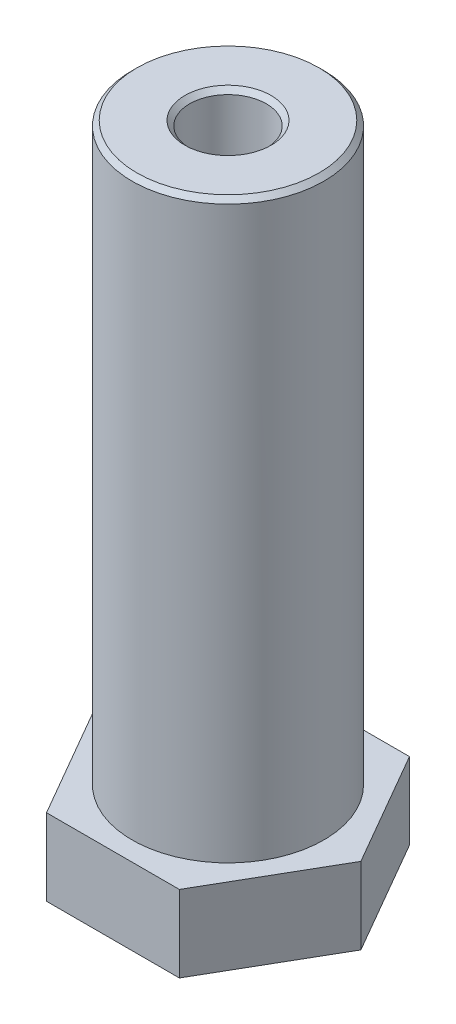
ISO-10303-21;
HEADER;
FILE_DESCRIPTION(('STEP AP214'),'2;1');
FILE_NAME('part.step','',(''),(''),'','','');
FILE_SCHEMA(('AUTOMOTIVE_DESIGN { 1 0 10303 214 1 1 1 1 }'));
ENDSEC;
DATA;
#1=APPLICATION_CONTEXT('core data for automotive mechanical design processes');
#2=APPLICATION_PROTOCOL_DEFINITION('international standard','automotive_design',2000,#1);
#3=PRODUCT_CONTEXT('',#1,'mechanical');
#4=PRODUCT('Part','Part','',(#3));
#5=PRODUCT_RELATED_PRODUCT_CATEGORY('part','',(#4));
#6=PRODUCT_DEFINITION_FORMATION('','',#4);
#7=PRODUCT_DEFINITION_CONTEXT('part definition',#1,'design');
#8=PRODUCT_DEFINITION('design','',#6,#7);
#9=PRODUCT_DEFINITION_SHAPE('','',#8);
#10=(LENGTH_UNIT() NAMED_UNIT(*) SI_UNIT(.MILLI.,.METRE.));
#11=(NAMED_UNIT(*) PLANE_ANGLE_UNIT() SI_UNIT($,.RADIAN.));
#12=(NAMED_UNIT(*) SI_UNIT($,.STERADIAN.) SOLID_ANGLE_UNIT());
#13=UNCERTAINTY_MEASURE_WITH_UNIT(LENGTH_MEASURE(1.E-05),#10,'distance_accuracy_value','');
#14=(GEOMETRIC_REPRESENTATION_CONTEXT(3) GLOBAL_UNCERTAINTY_ASSIGNED_CONTEXT((#13)) GLOBAL_UNIT_ASSIGNED_CONTEXT((#10,
#11,#12)) REPRESENTATION_CONTEXT('',''));
#15=CARTESIAN_POINT('',(0.,0.,0.));
#16=DIRECTION('',(0.,0.,1.));
#17=DIRECTION('',(1.,0.,0.));
#18=AXIS2_PLACEMENT_3D('',#15,#16,#17);
#19=CARTESIAN_POINT('',(0.,60.,0.));
#20=DIRECTION('',(0.,-1.,0.));
#21=DIRECTION('',(0.,0.,-1.));
#22=AXIS2_PLACEMENT_3D('',#19,#20,#21);
#23=CYLINDRICAL_SURFACE('',#22,4.);
#24=CARTESIAN_POINT('',(0.,-8.,0.));
#25=DIRECTION('',(0.,-1.,0.));
#26=DIRECTION('',(0.,0.,-1.));
#27=AXIS2_PLACEMENT_3D('',#24,#25,#26);
#28=CIRCLE('',#27,4.);
#29=CARTESIAN_POINT('',(0.,-8.,-4.));
#30=VERTEX_POINT('',#29);
#31=EDGE_CURVE('E19',#30,#30,#28,.F.);
#32=ORIENTED_EDGE('',*,*,#31,.F.);
#33=EDGE_LOOP('',(#32));
#34=FACE_BOUND('',#33,.T.);
#35=CARTESIAN_POINT('',(0.,59.4999999999004,0.));
#36=DIRECTION('',(0.,1.,0.));
#37=DIRECTION('',(0.,0.,1.));
#38=AXIS2_PLACEMENT_3D('',#35,#36,#37);
#39=CIRCLE('',#38,4.0000000000191);
#40=CARTESIAN_POINT('',(0.,59.4999999999004,4.0000000000191));
#41=VERTEX_POINT('',#40);
#42=EDGE_CURVE('E97',#41,#41,#39,.T.);
#43=ORIENTED_EDGE('',*,*,#42,.T.);
#44=EDGE_LOOP('',(#43));
#45=FACE_BOUND('',#44,.T.);
#46=ADVANCED_FACE('F16',(#34,#45),#23,.F.);
#47=CARTESIAN_POINT('',(0.,59.9999999999454,0.));
#48=DIRECTION('',(0.,1.,0.));
#49=DIRECTION('',(0.,0.,1.));
#50=AXIS2_PLACEMENT_3D('',#47,#48,#49);
#51=CONICAL_SURFACE('',#50,4.50000000000728,0.785398163340605);
#52=ORIENTED_EDGE('',*,*,#42,.F.);
#53=EDGE_LOOP('',(#52));
#54=FACE_BOUND('',#53,.T.);
#55=CARTESIAN_POINT('',(0.,59.9999999999454,0.));
#56=DIRECTION('',(0.,1.,0.));
#57=DIRECTION('',(0.,0.,1.));
#58=AXIS2_PLACEMENT_3D('',#55,#56,#57);
#59=CIRCLE('',#58,4.50000000000728);
#60=CARTESIAN_POINT('',(0.,59.9999999999454,4.50000000000728));
#61=VERTEX_POINT('',#60);
#62=EDGE_CURVE('E79',#61,#61,#59,.F.);
#63=ORIENTED_EDGE('',*,*,#62,.F.);
#64=EDGE_LOOP('',(#63));
#65=FACE_BOUND('',#64,.T.);
#66=ADVANCED_FACE('F111',(#54,#65),#51,.F.);
#67=CARTESIAN_POINT('',(0.,-8.,0.));
#68=DIRECTION('',(0.,-1.,0.));
#69=DIRECTION('',(0.,0.,-1.));
#70=AXIS2_PLACEMENT_3D('',#67,#68,#69);
#71=PLANE('',#70);
#72=DIRECTION('',(-0.5,0.,-0.866025403784439));
#73=VECTOR('',#72,1.);
#74=CARTESIAN_POINT('',(-6.92820323027551,-8.,12.));
#75=LINE('',#74,#73);
#76=CARTESIAN_POINT('',(-6.92820323027551,-8.,12.));
#77=VERTEX_POINT('',#76);
#78=CARTESIAN_POINT('',(-13.856406460551,-8.,0.));
#79=VERTEX_POINT('',#78);
#80=EDGE_CURVE('E249',#77,#79,#75,.T.);
#81=ORIENTED_EDGE('',*,*,#80,.T.);
#82=DIRECTION('',(0.5,0.,-0.866025403784439));
#83=VECTOR('',#82,1.);
#84=CARTESIAN_POINT('',(-13.856406460551,-8.,0.));
#85=LINE('',#84,#83);
#86=CARTESIAN_POINT('',(-6.92820323027551,-8.,-12.));
#87=VERTEX_POINT('',#86);
#88=EDGE_CURVE('E255',#79,#87,#85,.T.);
#89=ORIENTED_EDGE('',*,*,#88,.T.);
#90=DIRECTION('',(1.,0.,0.));
#91=VECTOR('',#90,1.);
#92=CARTESIAN_POINT('',(-6.92820323027551,-8.,-12.));
#93=LINE('',#92,#91);
#94=CARTESIAN_POINT('',(6.92820323027551,-8.,-12.));
#95=VERTEX_POINT('',#94);
#96=EDGE_CURVE('E75',#87,#95,#93,.T.);
#97=ORIENTED_EDGE('',*,*,#96,.T.);
#98=DIRECTION('',(0.5,0.,0.866025403784439));
#99=VECTOR('',#98,1.);
#100=CARTESIAN_POINT('',(6.92820323027551,-8.,-12.));
#101=LINE('',#100,#99);
#102=CARTESIAN_POINT('',(13.856406460551,-8.,0.));
#103=VERTEX_POINT('',#102);
#104=EDGE_CURVE('E70',#95,#103,#101,.T.);
#105=ORIENTED_EDGE('',*,*,#104,.T.);
#106=DIRECTION('',(-0.5,0.,0.866025403784438));
#107=VECTOR('',#106,1.);
#108=CARTESIAN_POINT('',(13.856406460551,-8.,0.));
#109=LINE('',#108,#107);
#110=CARTESIAN_POINT('',(6.92820323027551,-8.,12.));
#111=VERTEX_POINT('',#110);
#112=EDGE_CURVE('E67',#103,#111,#109,.T.);
#113=ORIENTED_EDGE('',*,*,#112,.T.);
#114=DIRECTION('',(-1.,0.,0.));
#115=VECTOR('',#114,1.);
#116=CARTESIAN_POINT('',(6.92820323027551,-8.,12.));
#117=LINE('',#116,#115);
#118=EDGE_CURVE('E93',#111,#77,#117,.T.);
#119=ORIENTED_EDGE('',*,*,#118,.T.);
#120=EDGE_LOOP('',(#81,#89,#97,#105,#113,#119));
#121=FACE_BOUND('',#120,.T.);
#122=ORIENTED_EDGE('',*,*,#31,.T.);
#123=EDGE_LOOP('',(#122));
#124=FACE_BOUND('',#123,.T.);
#125=ADVANCED_FACE('F72',(#121,#124),#71,.T.);
#126=CARTESIAN_POINT('',(0.,60.,0.));
#127=DIRECTION('',(0.,1.,0.));
#128=DIRECTION('',(0.,0.,1.));
#129=AXIS2_PLACEMENT_3D('',#126,#127,#128);
#130=PLANE('',#129);
#131=ORIENTED_EDGE('',*,*,#62,.T.);
#132=EDGE_LOOP('',(#131));
#133=FACE_BOUND('',#132,.T.);
#134=CARTESIAN_POINT('',(0.,60.,0.));
#135=DIRECTION('',(0.,-1.,0.));
#136=DIRECTION('',(1.,0.,0.));
#137=AXIS2_PLACEMENT_3D('',#134,#135,#136);
#138=CIRCLE('',#137,9.5);
#139=CARTESIAN_POINT('',(9.5,60.,0.));
#140=VERTEX_POINT('',#139);
#141=EDGE_CURVE('E100',#140,#140,#138,.T.);
#142=ORIENTED_EDGE('',*,*,#141,.F.);
#143=EDGE_LOOP('',(#142));
#144=FACE_BOUND('',#143,.T.);
#145=ADVANCED_FACE('F121',(#133,#144),#130,.T.);
#146=CARTESIAN_POINT('',(6.92820323027551,-8.,-12.));
#147=DIRECTION('',(-0.866025403784439,0.,0.5));
#148=DIRECTION('',(0.5,0.,0.866025403784439));
#149=AXIS2_PLACEMENT_3D('',#146,#147,#148);
#150=PLANE('',#149);
#151=DIRECTION('',(0.,1.,0.));
#152=VECTOR('',#151,1.);
#153=CARTESIAN_POINT('',(13.856406460551,-8.,0.));
#154=LINE('',#153,#152);
#155=CARTESIAN_POINT('',(13.856406460551,0.,0.));
#156=VERTEX_POINT('',#155);
#157=EDGE_CURVE('E78',#156,#103,#154,.F.);
#158=ORIENTED_EDGE('',*,*,#157,.T.);
#159=ORIENTED_EDGE('',*,*,#104,.F.);
#160=DIRECTION('',(0.,1.,0.));
#161=VECTOR('',#160,1.);
#162=CARTESIAN_POINT('',(6.92820323027551,-8.,-12.));
#163=LINE('',#162,#161);
#164=CARTESIAN_POINT('',(6.92820323027551,0.,-12.));
#165=VERTEX_POINT('',#164);
#166=EDGE_CURVE('E102',#95,#165,#163,.T.);
#167=ORIENTED_EDGE('',*,*,#166,.T.);
#168=DIRECTION('',(0.5,0.,0.866025403784439));
#169=VECTOR('',#168,1.);
#170=CARTESIAN_POINT('',(6.92820323027551,0.,-12.));
#171=LINE('',#170,#169);
#172=EDGE_CURVE('E84',#165,#156,#171,.T.);
#173=ORIENTED_EDGE('',*,*,#172,.T.);
#174=EDGE_LOOP('',(#158,#159,#167,#173));
#175=FACE_BOUND('',#174,.T.);
#176=ADVANCED_FACE('F82',(#175),#150,.F.);
#177=CARTESIAN_POINT('',(13.856406460551,-8.,0.));
#178=DIRECTION('',(-0.866025403784438,0.,-0.5));
#179=DIRECTION('',(-0.5,0.,0.866025403784438));
#180=AXIS2_PLACEMENT_3D('',#177,#178,#179);
#181=PLANE('',#180);
#182=DIRECTION('',(0.,1.,0.));
#183=VECTOR('',#182,1.);
#184=CARTESIAN_POINT('',(6.92820323027551,-8.,12.));
#185=LINE('',#184,#183);
#186=CARTESIAN_POINT('',(6.92820323027551,0.,12.));
#187=VERTEX_POINT('',#186);
#188=EDGE_CURVE('E90',#187,#111,#185,.F.);
#189=ORIENTED_EDGE('',*,*,#188,.T.);
#190=ORIENTED_EDGE('',*,*,#112,.F.);
#191=ORIENTED_EDGE('',*,*,#157,.F.);
#192=DIRECTION('',(-0.5,0.,0.866025403784439));
#193=VECTOR('',#192,1.);
#194=CARTESIAN_POINT('',(13.856406460551,0.,0.));
#195=LINE('',#194,#193);
#196=EDGE_CURVE('E267',#156,#187,#195,.T.);
#197=ORIENTED_EDGE('',*,*,#196,.T.);
#198=EDGE_LOOP('',(#189,#190,#191,#197));
#199=FACE_BOUND('',#198,.T.);
#200=ADVANCED_FACE('F88',(#199),#181,.F.);
#201=CARTESIAN_POINT('',(6.92820323027551,-8.,12.));
#202=DIRECTION('',(0.,0.,-1.));
#203=DIRECTION('',(-1.,0.,0.));
#204=AXIS2_PLACEMENT_3D('',#201,#202,#203);
#205=PLANE('',#204);
#206=DIRECTION('',(0.,1.,0.));
#207=VECTOR('',#206,1.);
#208=CARTESIAN_POINT('',(-6.92820323027551,-8.,12.));
#209=LINE('',#208,#207);
#210=CARTESIAN_POINT('',(-6.92820323027551,0.,12.));
#211=VERTEX_POINT('',#210);
#212=EDGE_CURVE('E244',#211,#77,#209,.F.);
#213=ORIENTED_EDGE('',*,*,#212,.T.);
#214=ORIENTED_EDGE('',*,*,#118,.F.);
#215=ORIENTED_EDGE('',*,*,#188,.F.);
#216=DIRECTION('',(1.,0.,0.));
#217=VECTOR('',#216,1.);
#218=CARTESIAN_POINT('',(0.,0.,12.));
#219=LINE('',#218,#217);
#220=EDGE_CURVE('E247',#187,#211,#219,.F.);
#221=ORIENTED_EDGE('',*,*,#220,.T.);
#222=EDGE_LOOP('',(#213,#214,#215,#221));
#223=FACE_BOUND('',#222,.T.);
#224=ADVANCED_FACE('F150',(#223),#205,.F.);
#225=CARTESIAN_POINT('',(-6.92820323027551,-8.,12.));
#226=DIRECTION('',(0.866025403784439,0.,-0.5));
#227=DIRECTION('',(-0.5,0.,-0.866025403784439));
#228=AXIS2_PLACEMENT_3D('',#225,#226,#227);
#229=PLANE('',#228);
#230=DIRECTION('',(0.,1.,0.));
#231=VECTOR('',#230,1.);
#232=CARTESIAN_POINT('',(-13.856406460551,-8.,0.));
#233=LINE('',#232,#231);
#234=CARTESIAN_POINT('',(-13.856406460551,0.,0.));
#235=VERTEX_POINT('',#234);
#236=EDGE_CURVE('E252',#235,#79,#233,.F.);
#237=ORIENTED_EDGE('',*,*,#236,.T.);
#238=ORIENTED_EDGE('',*,*,#80,.F.);
#239=ORIENTED_EDGE('',*,*,#212,.F.);
#240=DIRECTION('',(-0.5,0.,-0.866025403784439));
#241=VECTOR('',#240,1.);
#242=CARTESIAN_POINT('',(-6.92820323027551,0.,12.));
#243=LINE('',#242,#241);
#244=EDGE_CURVE('E270',#211,#235,#243,.T.);
#245=ORIENTED_EDGE('',*,*,#244,.T.);
#246=EDGE_LOOP('',(#237,#238,#239,#245));
#247=FACE_BOUND('',#246,.T.);
#248=ADVANCED_FACE('F147',(#247),#229,.F.);
#249=CARTESIAN_POINT('',(-13.856406460551,-8.,0.));
#250=DIRECTION('',(0.866025403784439,0.,0.5));
#251=DIRECTION('',(0.5,0.,-0.866025403784439));
#252=AXIS2_PLACEMENT_3D('',#249,#250,#251);
#253=PLANE('',#252);
#254=DIRECTION('',(0.,1.,0.));
#255=VECTOR('',#254,1.);
#256=CARTESIAN_POINT('',(-6.92820323027551,-8.,-12.));
#257=LINE('',#256,#255);
#258=CARTESIAN_POINT('',(-6.92820323027551,0.,-12.));
#259=VERTEX_POINT('',#258);
#260=EDGE_CURVE('E259',#259,#87,#257,.F.);
#261=ORIENTED_EDGE('',*,*,#260,.T.);
#262=ORIENTED_EDGE('',*,*,#88,.F.);
#263=ORIENTED_EDGE('',*,*,#236,.F.);
#264=DIRECTION('',(0.5,0.,-0.866025403784438));
#265=VECTOR('',#264,1.);
#266=CARTESIAN_POINT('',(-13.856406460551,0.,0.));
#267=LINE('',#266,#265);
#268=EDGE_CURVE('E34',#235,#259,#267,.T.);
#269=ORIENTED_EDGE('',*,*,#268,.T.);
#270=EDGE_LOOP('',(#261,#262,#263,#269));
#271=FACE_BOUND('',#270,.T.);
#272=ADVANCED_FACE('F143',(#271),#253,.F.);
#273=CARTESIAN_POINT('',(-6.92820323027551,-8.,-12.));
#274=DIRECTION('',(0.,0.,1.));
#275=DIRECTION('',(1.,0.,0.));
#276=AXIS2_PLACEMENT_3D('',#273,#274,#275);
#277=PLANE('',#276);
#278=ORIENTED_EDGE('',*,*,#166,.F.);
#279=ORIENTED_EDGE('',*,*,#96,.F.);
#280=ORIENTED_EDGE('',*,*,#260,.F.);
#281=DIRECTION('',(1.,0.,0.));
#282=VECTOR('',#281,1.);
#283=CARTESIAN_POINT('',(0.,0.,-12.));
#284=LINE('',#283,#282);
#285=EDGE_CURVE('E265',#259,#165,#284,.T.);
#286=ORIENTED_EDGE('',*,*,#285,.T.);
#287=EDGE_LOOP('',(#278,#279,#280,#286));
#288=FACE_BOUND('',#287,.T.);
#289=ADVANCED_FACE('F139',(#288),#277,.F.);
#290=CARTESIAN_POINT('',(0.,59.5,0.));
#291=DIRECTION('',(0.,-1.,0.));
#292=DIRECTION('',(1.,0.,0.));
#293=AXIS2_PLACEMENT_3D('',#290,#291,#292);
#294=CONICAL_SURFACE('',#293,10.,0.785398163397435);
#295=CARTESIAN_POINT('',(0.,59.5,0.));
#296=DIRECTION('',(0.,-1.,0.));
#297=DIRECTION('',(0.,0.,-1.));
#298=AXIS2_PLACEMENT_3D('',#295,#296,#297);
#299=CIRCLE('',#298,10.);
#300=CARTESIAN_POINT('',(0.,59.5,-10.));
#301=VERTEX_POINT('',#300);
#302=EDGE_CURVE('E25',#301,#301,#299,.T.);
#303=ORIENTED_EDGE('',*,*,#302,.F.);
#304=EDGE_LOOP('',(#303));
#305=FACE_BOUND('',#304,.T.);
#306=ORIENTED_EDGE('',*,*,#141,.T.);
#307=EDGE_LOOP('',(#306));
#308=FACE_BOUND('',#307,.T.);
#309=ADVANCED_FACE('F132',(#305,#308),#294,.T.);
#310=CARTESIAN_POINT('',(0.,0.,0.));
#311=DIRECTION('',(0.,-1.,0.));
#312=DIRECTION('',(0.,0.,-1.));
#313=AXIS2_PLACEMENT_3D('',#310,#311,#312);
#314=PLANE('',#313);
#315=CARTESIAN_POINT('',(0.,0.,0.));
#316=DIRECTION('',(0.,-1.,0.));
#317=DIRECTION('',(0.,0.,-1.));
#318=AXIS2_PLACEMENT_3D('',#315,#316,#317);
#319=CIRCLE('',#318,10.);
#320=CARTESIAN_POINT('',(0.,0.,-10.));
#321=VERTEX_POINT('',#320);
#322=EDGE_CURVE('E11',#321,#321,#319,.F.);
#323=ORIENTED_EDGE('',*,*,#322,.F.);
#324=EDGE_LOOP('',(#323));
#325=FACE_BOUND('',#324,.T.);
#326=ORIENTED_EDGE('',*,*,#268,.F.);
#327=ORIENTED_EDGE('',*,*,#244,.F.);
#328=ORIENTED_EDGE('',*,*,#220,.F.);
#329=ORIENTED_EDGE('',*,*,#196,.F.);
#330=ORIENTED_EDGE('',*,*,#172,.F.);
#331=ORIENTED_EDGE('',*,*,#285,.F.);
#332=EDGE_LOOP('',(#326,#327,#328,#329,#330,#331));
#333=FACE_BOUND('',#332,.T.);
#334=ADVANCED_FACE('F125',(#325,#333),#314,.F.);
#335=CARTESIAN_POINT('',(0.,60.,0.));
#336=DIRECTION('',(0.,-1.,0.));
#337=DIRECTION('',(0.,0.,-1.));
#338=AXIS2_PLACEMENT_3D('',#335,#336,#337);
#339=CYLINDRICAL_SURFACE('',#338,10.);
#340=ORIENTED_EDGE('',*,*,#322,.T.);
#341=EDGE_LOOP('',(#340));
#342=FACE_BOUND('',#341,.T.);
#343=ORIENTED_EDGE('',*,*,#302,.T.);
#344=EDGE_LOOP('',(#343));
#345=FACE_BOUND('',#344,.T.);
#346=ADVANCED_FACE('F123',(#342,#345),#339,.T.);
#347=CLOSED_SHELL('',(#46,#66,#125,#145,#176,#200,#224,#248,#272,#289,#309,#334,#346));
#348=MANIFOLD_SOLID_BREP('B1',#347);
#349=ADVANCED_BREP_SHAPE_REPRESENTATION('',(#18,#348),#14);
#350=SHAPE_DEFINITION_REPRESENTATION(#9,#349);
ENDSEC;
END-ISO-10303-21;
